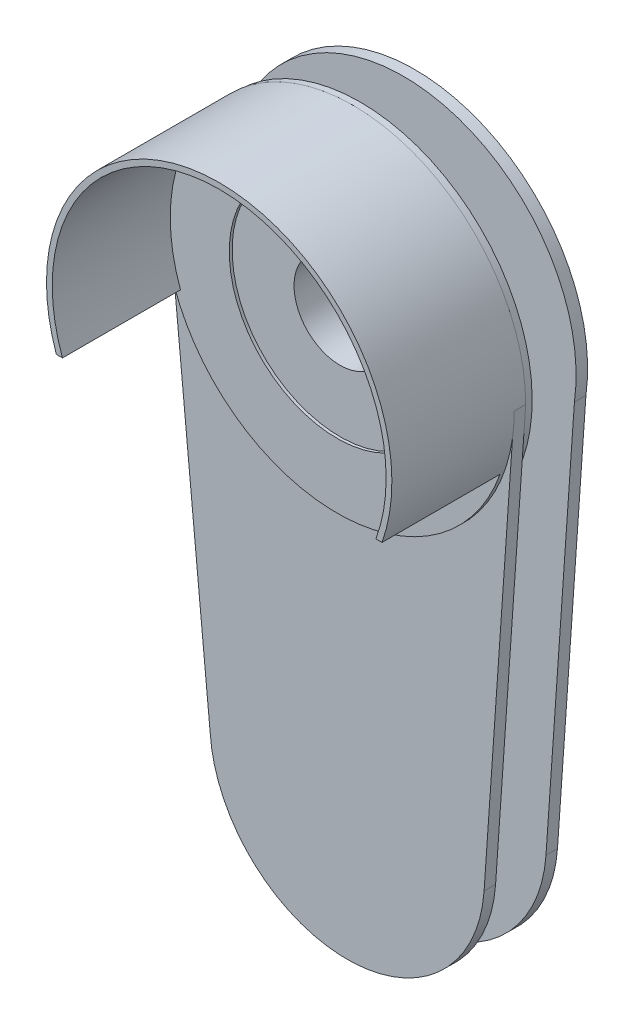
ISO-10303-21;
HEADER;
FILE_DESCRIPTION(('STEP AP214'),'2;1');
FILE_NAME('part.step','',(''),(''),'','','');
FILE_SCHEMA(('AUTOMOTIVE_DESIGN { 1 0 10303 214 1 1 1 1 }'));
ENDSEC;
DATA;
#1=APPLICATION_CONTEXT('core data for automotive mechanical design processes');
#2=APPLICATION_PROTOCOL_DEFINITION('international standard','automotive_design',2000,#1);
#3=PRODUCT_CONTEXT('',#1,'mechanical');
#4=PRODUCT('Part','Part','',(#3));
#5=PRODUCT_RELATED_PRODUCT_CATEGORY('part','',(#4));
#6=PRODUCT_DEFINITION_FORMATION('','',#4);
#7=PRODUCT_DEFINITION_CONTEXT('part definition',#1,'design');
#8=PRODUCT_DEFINITION('design','',#6,#7);
#9=PRODUCT_DEFINITION_SHAPE('','',#8);
#10=(LENGTH_UNIT() NAMED_UNIT(*) SI_UNIT(.MILLI.,.METRE.));
#11=(NAMED_UNIT(*) PLANE_ANGLE_UNIT() SI_UNIT($,.RADIAN.));
#12=(NAMED_UNIT(*) SI_UNIT($,.STERADIAN.) SOLID_ANGLE_UNIT());
#13=UNCERTAINTY_MEASURE_WITH_UNIT(LENGTH_MEASURE(1.E-05),#10,'distance_accuracy_value','');
#14=(GEOMETRIC_REPRESENTATION_CONTEXT(3) GLOBAL_UNCERTAINTY_ASSIGNED_CONTEXT((#13)) GLOBAL_UNIT_ASSIGNED_CONTEXT((#10,
#11,#12)) REPRESENTATION_CONTEXT('',''));
#15=CARTESIAN_POINT('',(0.,0.,0.));
#16=DIRECTION('',(0.,0.,1.));
#17=DIRECTION('',(1.,0.,0.));
#18=AXIS2_PLACEMENT_3D('',#15,#16,#17);
#19=CARTESIAN_POINT('',(0.,0.,0.));
#20=DIRECTION('',(0.,0.,1.));
#21=DIRECTION('',(1.,0.,0.));
#22=AXIS2_PLACEMENT_3D('',#19,#20,#21);
#23=PLANE('',#22);
#24=DIRECTION('',(-0.0697887398607694,-0.997561793468778,0.));
#25=VECTOR('',#24,1.);
#26=CARTESIAN_POINT('',(119.415543814638,-8.35422965993222,0.));
#27=LINE('',#26,#25);
#28=CARTESIAN_POINT('',(120.,0.,0.));
#29=VERTEX_POINT('',#28);
#30=CARTESIAN_POINT('',(118.831087629275,-16.7084593198645,0.));
#31=VERTEX_POINT('',#30);
#32=EDGE_CURVE('E202',#29,#31,#27,.T.);
#33=ORIENTED_EDGE('',*,*,#32,.F.);
#34=CARTESIAN_POINT('',(0.,0.,0.));
#35=DIRECTION('',(0.,0.,1.));
#36=DIRECTION('',(1.,0.,0.));
#37=AXIS2_PLACEMENT_3D('',#34,#35,#36);
#38=CIRCLE('',#37,120.);
#39=EDGE_CURVE('E247',#31,#29,#38,.T.);
#40=ORIENTED_EDGE('',*,*,#39,.F.);
#41=EDGE_LOOP('',(#33,#40));
#42=FACE_BOUND('',#41,.T.);
#43=ADVANCED_FACE('F34',(#42),#23,.F.);
#44=CARTESIAN_POINT('',(0.,0.,85.));
#45=DIRECTION('',(0.,0.,-1.));
#46=DIRECTION('',(-1.,0.,0.));
#47=AXIS2_PLACEMENT_3D('',#44,#45,#46);
#48=CYLINDRICAL_SURFACE('',#47,120.);
#49=ORIENTED_EDGE('',*,*,#39,.T.);
#50=DIRECTION('',(0.,0.,1.));
#51=VECTOR('',#50,1.);
#52=CARTESIAN_POINT('',(120.,0.,-8.));
#53=LINE('',#52,#51);
#54=CARTESIAN_POINT('',(120.,0.,-8.));
#55=VERTEX_POINT('',#54);
#56=EDGE_CURVE('E213',#55,#29,#53,.T.);
#57=ORIENTED_EDGE('',*,*,#56,.F.);
#58=CARTESIAN_POINT('',(0.,0.,-8.));
#59=DIRECTION('',(0.,0.,-1.));
#60=DIRECTION('',(-1.,0.,0.));
#61=AXIS2_PLACEMENT_3D('',#58,#59,#60);
#62=CIRCLE('',#61,120.);
#63=CARTESIAN_POINT('',(-120.,1.07552855510562E-13,-8.));
#64=VERTEX_POINT('',#63);
#65=EDGE_CURVE('E189',#64,#55,#62,.T.);
#66=ORIENTED_EDGE('',*,*,#65,.F.);
#67=DIRECTION('',(0.,0.,1.));
#68=VECTOR('',#67,1.);
#69=CARTESIAN_POINT('',(-120.,1.07552855510562E-13,-8.));
#70=LINE('',#69,#68);
#71=CARTESIAN_POINT('',(-120.,1.07552855510562E-13,0.));
#72=VERTEX_POINT('',#71);
#73=EDGE_CURVE('E216',#64,#72,#70,.T.);
#74=ORIENTED_EDGE('',*,*,#73,.T.);
#75=CARTESIAN_POINT('',(-117.805011812381,-22.8468639398211,0.));
#76=VERTEX_POINT('',#75);
#77=EDGE_CURVE('E257',#72,#76,#38,.T.);
#78=ORIENTED_EDGE('',*,*,#77,.T.);
#79=EDGE_CURVE('E259',#76,#31,#38,.T.);
#80=ORIENTED_EDGE('',*,*,#79,.T.);
#81=EDGE_LOOP('',(#49,#57,#66,#74,#78,#80));
#82=FACE_BOUND('',#81,.T.);
#83=DIRECTION('',(0.,0.,1.));
#84=VECTOR('',#83,1.);
#85=CARTESIAN_POINT('',(113.137084989848,-40.,3.));
#86=LINE('',#85,#84);
#87=CARTESIAN_POINT('',(113.137084989848,-40.,3.));
#88=VERTEX_POINT('',#87);
#89=CARTESIAN_POINT('',(113.137084989848,-40.,85.));
#90=VERTEX_POINT('',#89);
#91=EDGE_CURVE('E245',#88,#90,#86,.T.);
#92=ORIENTED_EDGE('',*,*,#91,.F.);
#93=CARTESIAN_POINT('',(0.,0.,3.));
#94=DIRECTION('',(0.,0.,1.));
#95=DIRECTION('',(1.,0.,0.));
#96=AXIS2_PLACEMENT_3D('',#93,#94,#95);
#97=CIRCLE('',#96,120.);
#98=CARTESIAN_POINT('',(-113.137084989848,-40.,3.));
#99=VERTEX_POINT('',#98);
#100=EDGE_CURVE('E233',#99,#88,#97,.T.);
#101=ORIENTED_EDGE('',*,*,#100,.F.);
#102=DIRECTION('',(0.,0.,1.));
#103=VECTOR('',#102,1.);
#104=CARTESIAN_POINT('',(-113.137084989848,-40.,3.));
#105=LINE('',#104,#103);
#106=CARTESIAN_POINT('',(-113.137084989848,-40.,85.));
#107=VERTEX_POINT('',#106);
#108=EDGE_CURVE('E248',#99,#107,#105,.T.);
#109=ORIENTED_EDGE('',*,*,#108,.T.);
#110=CARTESIAN_POINT('',(0.,0.,85.));
#111=DIRECTION('',(0.,0.,1.));
#112=DIRECTION('',(1.,0.,0.));
#113=AXIS2_PLACEMENT_3D('',#110,#111,#112);
#114=CIRCLE('',#113,120.);
#115=EDGE_CURVE('E255',#90,#107,#114,.T.);
#116=ORIENTED_EDGE('',*,*,#115,.F.);
#117=EDGE_LOOP('',(#92,#101,#109,#116));
#118=FACE_BOUND('',#117,.T.);
#119=ADVANCED_FACE('F36',(#82,#118),#48,.T.);
#120=CARTESIAN_POINT('',(0.,0.,85.));
#121=DIRECTION('',(0.,0.,1.));
#122=DIRECTION('',(1.,0.,0.));
#123=AXIS2_PLACEMENT_3D('',#120,#121,#122);
#124=PLANE('',#123);
#125=CARTESIAN_POINT('',(0.,0.,85.));
#126=DIRECTION('',(0.,0.,1.));
#127=DIRECTION('',(1.,0.,0.));
#128=AXIS2_PLACEMENT_3D('',#125,#126,#127);
#129=CIRCLE('',#128,116.);
#130=CARTESIAN_POINT('',(108.88526071053,-40.,85.));
#131=VERTEX_POINT('',#130);
#132=CARTESIAN_POINT('',(-108.88526071053,-40.,85.));
#133=VERTEX_POINT('',#132);
#134=EDGE_CURVE('E240',#131,#133,#129,.T.);
#135=ORIENTED_EDGE('',*,*,#134,.F.);
#136=DIRECTION('',(1.,0.,0.));
#137=VECTOR('',#136,1.);
#138=CARTESIAN_POINT('',(0.,-40.,85.));
#139=LINE('',#138,#137);
#140=EDGE_CURVE('E237',#131,#90,#139,.T.);
#141=ORIENTED_EDGE('',*,*,#140,.T.);
#142=ORIENTED_EDGE('',*,*,#115,.T.);
#143=DIRECTION('',(1.,0.,0.));
#144=VECTOR('',#143,1.);
#145=CARTESIAN_POINT('',(0.,-40.,85.));
#146=LINE('',#145,#144);
#147=EDGE_CURVE('E228',#107,#133,#146,.T.);
#148=ORIENTED_EDGE('',*,*,#147,.T.);
#149=EDGE_LOOP('',(#135,#141,#142,#148));
#150=FACE_BOUND('',#149,.T.);
#151=ADVANCED_FACE('F291',(#150),#124,.T.);
#152=ORIENTED_EDGE('',*,*,#77,.F.);
#153=DIRECTION('',(0.0956335930260791,-0.995416604183857,0.));
#154=VECTOR('',#153,1.);
#155=CARTESIAN_POINT('',(-118.902505906191,-11.4234319699105,0.));
#156=LINE('',#155,#154);
#157=EDGE_CURVE('E199',#72,#76,#156,.T.);
#158=ORIENTED_EDGE('',*,*,#157,.T.);
#159=EDGE_LOOP('',(#152,#158));
#160=FACE_BOUND('',#159,.T.);
#161=ADVANCED_FACE('F287',(#160),#23,.F.);
#162=CARTESIAN_POINT('',(0.,-40.,3.));
#163=DIRECTION('',(0.,-1.,0.));
#164=DIRECTION('',(0.,0.,-1.));
#165=AXIS2_PLACEMENT_3D('',#162,#163,#164);
#166=PLANE('',#165);
#167=ORIENTED_EDGE('',*,*,#140,.F.);
#168=DIRECTION('',(0.,0.,1.));
#169=VECTOR('',#168,1.);
#170=CARTESIAN_POINT('',(108.88526071053,-40.,3.));
#171=LINE('',#170,#169);
#172=CARTESIAN_POINT('',(108.88526071053,-40.,3.));
#173=VERTEX_POINT('',#172);
#174=EDGE_CURVE('E236',#173,#131,#171,.T.);
#175=ORIENTED_EDGE('',*,*,#174,.F.);
#176=DIRECTION('',(1.,0.,0.));
#177=VECTOR('',#176,1.);
#178=CARTESIAN_POINT('',(0.,-40.,3.));
#179=LINE('',#178,#177);
#180=EDGE_CURVE('E225',#173,#88,#179,.T.);
#181=ORIENTED_EDGE('',*,*,#180,.T.);
#182=ORIENTED_EDGE('',*,*,#91,.T.);
#183=EDGE_LOOP('',(#167,#175,#181,#182));
#184=FACE_BOUND('',#183,.T.);
#185=ADVANCED_FACE('F294',(#184),#166,.T.);
#186=CARTESIAN_POINT('',(0.,-40.,3.));
#187=DIRECTION('',(0.,-1.,0.));
#188=DIRECTION('',(0.,0.,-1.));
#189=AXIS2_PLACEMENT_3D('',#186,#187,#188);
#190=PLANE('',#189);
#191=ORIENTED_EDGE('',*,*,#147,.F.);
#192=ORIENTED_EDGE('',*,*,#108,.F.);
#193=DIRECTION('',(1.,0.,0.));
#194=VECTOR('',#193,1.);
#195=CARTESIAN_POINT('',(0.,-40.,3.));
#196=LINE('',#195,#194);
#197=CARTESIAN_POINT('',(-108.88526071053,-40.,3.));
#198=VERTEX_POINT('',#197);
#199=EDGE_CURVE('E231',#99,#198,#196,.T.);
#200=ORIENTED_EDGE('',*,*,#199,.T.);
#201=DIRECTION('',(0.,0.,1.));
#202=VECTOR('',#201,1.);
#203=CARTESIAN_POINT('',(-108.88526071053,-40.,3.));
#204=LINE('',#203,#202);
#205=EDGE_CURVE('E251',#198,#133,#204,.T.);
#206=ORIENTED_EDGE('',*,*,#205,.T.);
#207=EDGE_LOOP('',(#191,#192,#200,#206));
#208=FACE_BOUND('',#207,.T.);
#209=ADVANCED_FACE('F299',(#208),#190,.T.);
#210=CARTESIAN_POINT('',(0.,0.,3.));
#211=DIRECTION('',(0.,0.,1.));
#212=DIRECTION('',(1.,0.,0.));
#213=AXIS2_PLACEMENT_3D('',#210,#211,#212);
#214=CYLINDRICAL_SURFACE('',#213,116.);
#215=ORIENTED_EDGE('',*,*,#134,.T.);
#216=ORIENTED_EDGE('',*,*,#205,.F.);
#217=CARTESIAN_POINT('',(0.,0.,3.));
#218=DIRECTION('',(0.,0.,1.));
#219=DIRECTION('',(1.,0.,0.));
#220=AXIS2_PLACEMENT_3D('',#217,#218,#219);
#221=CIRCLE('',#220,116.);
#222=EDGE_CURVE('E227',#173,#198,#221,.T.);
#223=ORIENTED_EDGE('',*,*,#222,.F.);
#224=ORIENTED_EDGE('',*,*,#174,.T.);
#225=EDGE_LOOP('',(#215,#216,#223,#224));
#226=FACE_BOUND('',#225,.T.);
#227=ADVANCED_FACE('F307',(#226),#214,.F.);
#228=CARTESIAN_POINT('',(0.,0.,3.));
#229=DIRECTION('',(0.,0.,1.));
#230=DIRECTION('',(1.,0.,0.));
#231=AXIS2_PLACEMENT_3D('',#228,#229,#230);
#232=PLANE('',#231);
#233=CARTESIAN_POINT('',(0.,0.,3.));
#234=DIRECTION('',(0.,0.,1.));
#235=DIRECTION('',(1.,0.,0.));
#236=AXIS2_PLACEMENT_3D('',#233,#234,#235);
#237=CIRCLE('',#236,75.);
#238=CARTESIAN_POINT('',(75.,0.,3.));
#239=VERTEX_POINT('',#238);
#240=EDGE_CURVE('E38',#239,#239,#237,.T.);
#241=ORIENTED_EDGE('',*,*,#240,.F.);
#242=EDGE_LOOP('',(#241));
#243=FACE_BOUND('',#242,.T.);
#244=ORIENTED_EDGE('',*,*,#180,.F.);
#245=ORIENTED_EDGE('',*,*,#222,.T.);
#246=ORIENTED_EDGE('',*,*,#199,.F.);
#247=ORIENTED_EDGE('',*,*,#100,.T.);
#248=EDGE_LOOP('',(#244,#245,#246,#247));
#249=FACE_BOUND('',#248,.T.);
#250=ADVANCED_FACE('F310',(#243,#249),#232,.T.);
#251=CARTESIAN_POINT('',(0.,0.,1.));
#252=DIRECTION('',(0.,0.,1.));
#253=DIRECTION('',(1.,0.,0.));
#254=AXIS2_PLACEMENT_3D('',#251,#252,#253);
#255=CYLINDRICAL_SURFACE('',#254,75.);
#256=ORIENTED_EDGE('',*,*,#240,.T.);
#257=EDGE_LOOP('',(#256));
#258=FACE_BOUND('',#257,.T.);
#259=CARTESIAN_POINT('',(0.,0.,1.));
#260=DIRECTION('',(0.,0.,1.));
#261=DIRECTION('',(1.,0.,0.));
#262=AXIS2_PLACEMENT_3D('',#259,#260,#261);
#263=CIRCLE('',#262,75.);
#264=CARTESIAN_POINT('',(75.,0.,1.));
#265=VERTEX_POINT('',#264);
#266=EDGE_CURVE('E222',#265,#265,#263,.T.);
#267=ORIENTED_EDGE('',*,*,#266,.F.);
#268=EDGE_LOOP('',(#267));
#269=FACE_BOUND('',#268,.T.);
#270=ADVANCED_FACE('F317',(#258,#269),#255,.F.);
#271=CARTESIAN_POINT('',(0.,0.,1.));
#272=DIRECTION('',(0.,0.,1.));
#273=DIRECTION('',(1.,0.,0.));
#274=AXIS2_PLACEMENT_3D('',#271,#272,#273);
#275=PLANE('',#274);
#276=CARTESIAN_POINT('',(0.,0.,1.));
#277=DIRECTION('',(0.,0.,1.));
#278=DIRECTION('',(1.,0.,0.));
#279=AXIS2_PLACEMENT_3D('',#276,#277,#278);
#280=CIRCLE('',#279,32.);
#281=CARTESIAN_POINT('',(32.,0.,1.));
#282=VERTEX_POINT('',#281);
#283=EDGE_CURVE('E219',#282,#282,#280,.T.);
#284=ORIENTED_EDGE('',*,*,#283,.F.);
#285=EDGE_LOOP('',(#284));
#286=FACE_BOUND('',#285,.T.);
#287=ORIENTED_EDGE('',*,*,#266,.T.);
#288=EDGE_LOOP('',(#287));
#289=FACE_BOUND('',#288,.T.);
#290=ADVANCED_FACE('F321',(#286,#289),#275,.T.);
#291=CARTESIAN_POINT('',(0.,0.,-4.));
#292=DIRECTION('',(0.,0.,1.));
#293=DIRECTION('',(1.,0.,0.));
#294=AXIS2_PLACEMENT_3D('',#291,#292,#293);
#295=CYLINDRICAL_SURFACE('',#294,32.);
#296=ORIENTED_EDGE('',*,*,#283,.T.);
#297=EDGE_LOOP('',(#296));
#298=FACE_BOUND('',#297,.T.);
#299=CARTESIAN_POINT('',(0.,0.,-51.));
#300=DIRECTION('',(0.,0.,-1.));
#301=DIRECTION('',(-1.,0.,0.));
#302=AXIS2_PLACEMENT_3D('',#299,#300,#301);
#303=CIRCLE('',#302,32.);
#304=CARTESIAN_POINT('',(-32.,0.,-51.));
#305=VERTEX_POINT('',#304);
#306=EDGE_CURVE('E167',#305,#305,#303,.T.);
#307=ORIENTED_EDGE('',*,*,#306,.T.);
#308=EDGE_LOOP('',(#307));
#309=FACE_BOUND('',#308,.T.);
#310=ADVANCED_FACE('F325',(#298,#309),#295,.F.);
#311=CARTESIAN_POINT('',(-118.902505906191,-11.4234319699105,-8.));
#312=DIRECTION('',(-0.995416604183857,-0.0956335930260791,0.));
#313=DIRECTION('',(0.0956335930260791,-0.995416604183857,0.));
#314=AXIS2_PLACEMENT_3D('',#311,#312,#313);
#315=PLANE('',#314);
#316=ORIENTED_EDGE('',*,*,#157,.F.);
#317=ORIENTED_EDGE('',*,*,#73,.F.);
#318=DIRECTION('',(0.0956335930260791,-0.995416604183857,0.));
#319=VECTOR('',#318,1.);
#320=CARTESIAN_POINT('',(-118.902505906191,-11.4234319699105,-8.));
#321=LINE('',#320,#319);
#322=CARTESIAN_POINT('',(-119.112820752503,-9.23433833135846,-8.));
#323=VERTEX_POINT('',#322);
#324=EDGE_CURVE('E186',#64,#323,#321,.T.);
#325=ORIENTED_EDGE('',*,*,#324,.T.);
#326=CARTESIAN_POINT('',(-118.692191059879,-13.6125256084625,-8.));
#327=VERTEX_POINT('',#326);
#328=EDGE_CURVE('E190',#323,#327,#321,.T.);
#329=ORIENTED_EDGE('',*,*,#328,.T.);
#330=CARTESIAN_POINT('',(-91.3099220921763,-298.624981255157,-8.));
#331=VERTEX_POINT('',#330);
#332=EDGE_CURVE('E191',#327,#331,#321,.T.);
#333=ORIENTED_EDGE('',*,*,#332,.T.);
#334=DIRECTION('',(0.,0.,1.));
#335=VECTOR('',#334,1.);
#336=CARTESIAN_POINT('',(-91.3099220921763,-298.624981255157,-8.));
#337=LINE('',#336,#335);
#338=CARTESIAN_POINT('',(-91.3099220921763,-298.624981255157,0.));
#339=VERTEX_POINT('',#338);
#340=EDGE_CURVE('E198',#331,#339,#337,.T.);
#341=ORIENTED_EDGE('',*,*,#340,.T.);
#342=EDGE_CURVE('E183',#76,#339,#156,.T.);
#343=ORIENTED_EDGE('',*,*,#342,.F.);
#344=EDGE_LOOP('',(#316,#317,#325,#329,#333,#341,#343));
#345=FACE_BOUND('',#344,.T.);
#346=ADVANCED_FACE('F275',(#345),#315,.T.);
#347=CARTESIAN_POINT('',(119.415543814638,-8.35422965993222,-8.));
#348=DIRECTION('',(-0.997561793468778,0.0697887398607694,0.));
#349=DIRECTION('',(-0.0697887398607694,-0.997561793468779,0.));
#350=AXIS2_PLACEMENT_3D('',#347,#348,#349);
#351=PLANE('',#350);
#352=ORIENTED_EDGE('',*,*,#32,.T.);
#353=CARTESIAN_POINT('',(99.0633780417692,-299.268538040634,0.));
#354=VERTEX_POINT('',#353);
#355=EDGE_CURVE('E201',#31,#354,#27,.T.);
#356=ORIENTED_EDGE('',*,*,#355,.T.);
#357=DIRECTION('',(0.,0.,1.));
#358=VECTOR('',#357,1.);
#359=CARTESIAN_POINT('',(99.0633780417692,-299.268538040634,-8.));
#360=LINE('',#359,#358);
#361=CARTESIAN_POINT('',(99.0633780417692,-299.268538040634,-8.));
#362=VERTEX_POINT('',#361);
#363=EDGE_CURVE('E210',#362,#354,#360,.T.);
#364=ORIENTED_EDGE('',*,*,#363,.F.);
#365=DIRECTION('',(-0.0697887398607694,-0.997561793468778,0.));
#366=VECTOR('',#365,1.);
#367=CARTESIAN_POINT('',(119.415543814638,-8.35422965993222,-8.));
#368=LINE('',#367,#366);
#369=EDGE_CURVE('E193',#55,#362,#368,.T.);
#370=ORIENTED_EDGE('',*,*,#369,.F.);
#371=ORIENTED_EDGE('',*,*,#56,.T.);
#372=EDGE_LOOP('',(#352,#356,#364,#370,#371));
#373=FACE_BOUND('',#372,.T.);
#374=ADVANCED_FACE('F284',(#373),#351,.F.);
#375=CARTESIAN_POINT('',(3.8981465337455,-292.610843621114,-8.));
#376=DIRECTION('',(0.,0.,1.));
#377=DIRECTION('',(1.,0.,0.));
#378=AXIS2_PLACEMENT_3D('',#375,#376,#377);
#379=CYLINDRICAL_SURFACE('',#378,95.397831122932);
#380=CARTESIAN_POINT('',(3.8981465337455,-292.610843621114,0.));
#381=DIRECTION('',(0.,0.,-1.));
#382=DIRECTION('',(-1.,0.,0.));
#383=AXIS2_PLACEMENT_3D('',#380,#381,#382);
#384=CIRCLE('',#383,95.397831122932);
#385=EDGE_CURVE('E205',#354,#339,#384,.T.);
#386=ORIENTED_EDGE('',*,*,#385,.T.);
#387=ORIENTED_EDGE('',*,*,#340,.F.);
#388=CARTESIAN_POINT('',(3.8981465337455,-292.610843621114,-8.));
#389=DIRECTION('',(0.,0.,-1.));
#390=DIRECTION('',(-1.,0.,0.));
#391=AXIS2_PLACEMENT_3D('',#388,#389,#390);
#392=CIRCLE('',#391,95.397831122932);
#393=EDGE_CURVE('E195',#362,#331,#392,.T.);
#394=ORIENTED_EDGE('',*,*,#393,.F.);
#395=ORIENTED_EDGE('',*,*,#363,.T.);
#396=EDGE_LOOP('',(#386,#387,#394,#395));
#397=FACE_BOUND('',#396,.T.);
#398=ADVANCED_FACE('F280',(#397),#379,.T.);
#399=CARTESIAN_POINT('',(0.,0.,-8.));
#400=DIRECTION('',(0.,0.,-1.));
#401=DIRECTION('',(-1.,0.,0.));
#402=AXIS2_PLACEMENT_3D('',#399,#400,#401);
#403=PLANE('',#402);
#404=CARTESIAN_POINT('',(0.,0.,-8.));
#405=DIRECTION('',(0.,0.,-1.));
#406=DIRECTION('',(-1.,0.,0.));
#407=AXIS2_PLACEMENT_3D('',#404,#405,#406);
#408=CIRCLE('',#407,119.470235088225);
#409=EDGE_CURVE('E43',#323,#327,#408,.T.);
#410=ORIENTED_EDGE('',*,*,#409,.F.);
#411=ORIENTED_EDGE('',*,*,#324,.F.);
#412=ORIENTED_EDGE('',*,*,#65,.T.);
#413=ORIENTED_EDGE('',*,*,#369,.T.);
#414=ORIENTED_EDGE('',*,*,#393,.T.);
#415=ORIENTED_EDGE('',*,*,#332,.F.);
#416=EDGE_LOOP('',(#410,#411,#412,#413,#414,#415));
#417=FACE_BOUND('',#416,.T.);
#418=ADVANCED_FACE('F336',(#417),#403,.T.);
#419=CARTESIAN_POINT('',(0.,0.,0.));
#420=DIRECTION('',(0.,0.,-1.));
#421=DIRECTION('',(-1.,0.,0.));
#422=AXIS2_PLACEMENT_3D('',#419,#420,#421);
#423=PLANE('',#422);
#424=ORIENTED_EDGE('',*,*,#79,.F.);
#425=ORIENTED_EDGE('',*,*,#342,.T.);
#426=ORIENTED_EDGE('',*,*,#385,.F.);
#427=ORIENTED_EDGE('',*,*,#355,.F.);
#428=EDGE_LOOP('',(#424,#425,#426,#427));
#429=FACE_BOUND('',#428,.T.);
#430=ADVANCED_FACE('F272',(#429),#423,.F.);
#431=CARTESIAN_POINT('',(0.,0.,-8.));
#432=DIRECTION('',(0.,0.,-1.));
#433=DIRECTION('',(-1.,0.,0.));
#434=AXIS2_PLACEMENT_3D('',#431,#432,#433);
#435=PLANE('',#434);
#436=ORIENTED_EDGE('',*,*,#328,.F.);
#437=EDGE_CURVE('E178',#327,#323,#408,.T.);
#438=ORIENTED_EDGE('',*,*,#437,.F.);
#439=EDGE_LOOP('',(#436,#438));
#440=FACE_BOUND('',#439,.T.);
#441=ADVANCED_FACE('F339',(#440),#435,.F.);
#442=CARTESIAN_POINT('',(0.,0.,-13.));
#443=DIRECTION('',(0.,0.,-1.));
#444=DIRECTION('',(-1.,0.,0.));
#445=AXIS2_PLACEMENT_3D('',#442,#443,#444);
#446=PLANE('',#445);
#447=CARTESIAN_POINT('',(0.,0.,-13.));
#448=DIRECTION('',(0.,0.,-1.));
#449=DIRECTION('',(-1.,0.,0.));
#450=AXIS2_PLACEMENT_3D('',#447,#448,#449);
#451=CIRCLE('',#450,70.);
#452=CARTESIAN_POINT('',(-70.,0.,-13.));
#453=VERTEX_POINT('',#452);
#454=EDGE_CURVE('E11',#453,#453,#451,.T.);
#455=ORIENTED_EDGE('',*,*,#454,.F.);
#456=EDGE_LOOP('',(#455));
#457=FACE_BOUND('',#456,.T.);
#458=CARTESIAN_POINT('',(0.,0.,-13.));
#459=DIRECTION('',(0.,0.,-1.));
#460=DIRECTION('',(-1.,0.,0.));
#461=AXIS2_PLACEMENT_3D('',#458,#459,#460);
#462=CIRCLE('',#461,119.470235088225);
#463=CARTESIAN_POINT('',(-119.470235088225,0.,-13.));
#464=VERTEX_POINT('',#463);
#465=EDGE_CURVE('E180',#464,#464,#462,.T.);
#466=ORIENTED_EDGE('',*,*,#465,.T.);
#467=EDGE_LOOP('',(#466));
#468=FACE_BOUND('',#467,.T.);
#469=ADVANCED_FACE('F347',(#457,#468),#446,.T.);
#470=CARTESIAN_POINT('',(0.,0.,-13.));
#471=DIRECTION('',(0.,0.,1.));
#472=DIRECTION('',(1.,0.,0.));
#473=AXIS2_PLACEMENT_3D('',#470,#471,#472);
#474=CYLINDRICAL_SURFACE('',#473,119.470235088225);
#475=ORIENTED_EDGE('',*,*,#465,.F.);
#476=EDGE_LOOP('',(#475));
#477=FACE_BOUND('',#476,.T.);
#478=ORIENTED_EDGE('',*,*,#437,.T.);
#479=ORIENTED_EDGE('',*,*,#409,.T.);
#480=EDGE_LOOP('',(#478,#479));
#481=FACE_BOUND('',#480,.T.);
#482=ADVANCED_FACE('F343',(#477,#481),#474,.T.);
#483=CARTESIAN_POINT('',(0.,0.,-43.));
#484=DIRECTION('',(0.,0.,1.));
#485=DIRECTION('',(1.,0.,0.));
#486=AXIS2_PLACEMENT_3D('',#483,#484,#485);
#487=CYLINDRICAL_SURFACE('',#486,70.);
#488=CARTESIAN_POINT('',(0.,0.,-43.));
#489=DIRECTION('',(0.,0.,-1.));
#490=DIRECTION('',(-1.,0.,0.));
#491=AXIS2_PLACEMENT_3D('',#488,#489,#490);
#492=CIRCLE('',#491,70.);
#493=CARTESIAN_POINT('',(-70.,0.,-43.));
#494=VERTEX_POINT('',#493);
#495=EDGE_CURVE('E175',#494,#494,#492,.T.);
#496=ORIENTED_EDGE('',*,*,#495,.F.);
#497=EDGE_LOOP('',(#496));
#498=FACE_BOUND('',#497,.T.);
#499=ORIENTED_EDGE('',*,*,#454,.T.);
#500=EDGE_LOOP('',(#499));
#501=FACE_BOUND('',#500,.T.);
#502=ADVANCED_FACE('F346',(#498,#501),#487,.T.);
#503=CARTESIAN_POINT('',(0.,0.,-51.));
#504=DIRECTION('',(0.,0.,1.));
#505=DIRECTION('',(1.,0.,0.));
#506=AXIS2_PLACEMENT_3D('',#503,#504,#505);
#507=CYLINDRICAL_SURFACE('',#506,120.);
#508=CARTESIAN_POINT('',(0.,0.,-43.));
#509=DIRECTION('',(0.,0.,-1.));
#510=DIRECTION('',(-1.,0.,0.));
#511=AXIS2_PLACEMENT_3D('',#508,#509,#510);
#512=CIRCLE('',#511,120.);
#513=CARTESIAN_POINT('',(-117.805011812381,-22.8468639398209,-43.));
#514=VERTEX_POINT('',#513);
#515=CARTESIAN_POINT('',(118.831087629275,-16.7084593198645,-43.));
#516=VERTEX_POINT('',#515);
#517=EDGE_CURVE('E173',#514,#516,#512,.T.);
#518=ORIENTED_EDGE('',*,*,#517,.T.);
#519=DIRECTION('',(0.,0.,-1.));
#520=VECTOR('',#519,1.);
#521=CARTESIAN_POINT('',(118.831087629275,-16.7084593198645,-43.));
#522=LINE('',#521,#520);
#523=CARTESIAN_POINT('',(118.831087629275,-16.7084593198645,-51.));
#524=VERTEX_POINT('',#523);
#525=EDGE_CURVE('E56',#516,#524,#522,.T.);
#526=ORIENTED_EDGE('',*,*,#525,.T.);
#527=CARTESIAN_POINT('',(0.,0.,-51.));
#528=DIRECTION('',(0.,0.,-1.));
#529=DIRECTION('',(-1.,0.,0.));
#530=AXIS2_PLACEMENT_3D('',#527,#528,#529);
#531=CIRCLE('',#530,120.);
#532=CARTESIAN_POINT('',(-117.805011812381,-22.8468639398211,-51.));
#533=VERTEX_POINT('',#532);
#534=EDGE_CURVE('E51',#533,#524,#531,.T.);
#535=ORIENTED_EDGE('',*,*,#534,.F.);
#536=DIRECTION('',(0.,0.,-1.));
#537=VECTOR('',#536,1.);
#538=CARTESIAN_POINT('',(-117.805011812381,-22.8468639398209,-43.));
#539=LINE('',#538,#537);
#540=EDGE_CURVE('E168',#514,#533,#539,.T.);
#541=ORIENTED_EDGE('',*,*,#540,.F.);
#542=EDGE_LOOP('',(#518,#526,#535,#541));
#543=FACE_BOUND('',#542,.T.);
#544=ADVANCED_FACE('F357',(#543),#507,.T.);
#545=CARTESIAN_POINT('',(0.,0.,-51.));
#546=DIRECTION('',(0.,0.,-1.));
#547=DIRECTION('',(-1.,0.,0.));
#548=AXIS2_PLACEMENT_3D('',#545,#546,#547);
#549=PLANE('',#548);
#550=ORIENTED_EDGE('',*,*,#306,.F.);
#551=EDGE_LOOP('',(#550));
#552=FACE_BOUND('',#551,.T.);
#553=ORIENTED_EDGE('',*,*,#534,.T.);
#554=DIRECTION('',(-0.0697887398607694,-0.997561793468778,0.));
#555=VECTOR('',#554,1.);
#556=CARTESIAN_POINT('',(119.415543814638,-8.35422965993222,-51.));
#557=LINE('',#556,#555);
#558=CARTESIAN_POINT('',(99.0633780417692,-299.268538040633,-51.));
#559=VERTEX_POINT('',#558);
#560=EDGE_CURVE('E163',#524,#559,#557,.T.);
#561=ORIENTED_EDGE('',*,*,#560,.T.);
#562=CARTESIAN_POINT('',(3.8981465337455,-292.610843621114,-51.));
#563=DIRECTION('',(0.,0.,-1.));
#564=DIRECTION('',(-1.,0.,0.));
#565=AXIS2_PLACEMENT_3D('',#562,#563,#564);
#566=CIRCLE('',#565,95.397831122932);
#567=CARTESIAN_POINT('',(-91.3099220921763,-298.624981255157,-51.));
#568=VERTEX_POINT('',#567);
#569=EDGE_CURVE('E141',#559,#568,#566,.T.);
#570=ORIENTED_EDGE('',*,*,#569,.T.);
#571=DIRECTION('',(-0.0956335930260791,0.995416604183858,0.));
#572=VECTOR('',#571,1.);
#573=CARTESIAN_POINT('',(-118.902505906191,-11.4234319699105,-51.));
#574=LINE('',#573,#572);
#575=EDGE_CURVE('E157',#568,#533,#574,.T.);
#576=ORIENTED_EDGE('',*,*,#575,.T.);
#577=EDGE_LOOP('',(#553,#561,#570,#576));
#578=FACE_BOUND('',#577,.T.);
#579=ADVANCED_FACE('F361',(#552,#578),#549,.T.);
#580=CARTESIAN_POINT('',(0.,0.,-43.));
#581=DIRECTION('',(0.,0.,-1.));
#582=DIRECTION('',(-1.,0.,0.));
#583=AXIS2_PLACEMENT_3D('',#580,#581,#582);
#584=PLANE('',#583);
#585=ORIENTED_EDGE('',*,*,#495,.T.);
#586=EDGE_LOOP('',(#585));
#587=FACE_BOUND('',#586,.T.);
#588=ORIENTED_EDGE('',*,*,#517,.F.);
#589=DIRECTION('',(-0.0956335930260791,0.995416604183858,0.));
#590=VECTOR('',#589,1.);
#591=CARTESIAN_POINT('',(-118.902505906191,-11.4234319699105,-43.));
#592=LINE('',#591,#590);
#593=CARTESIAN_POINT('',(-91.3099220921763,-298.624981255157,-43.));
#594=VERTEX_POINT('',#593);
#595=EDGE_CURVE('E147',#594,#514,#592,.T.);
#596=ORIENTED_EDGE('',*,*,#595,.F.);
#597=CARTESIAN_POINT('',(3.8981465337455,-292.610843621114,-43.));
#598=DIRECTION('',(0.,0.,-1.));
#599=DIRECTION('',(-1.,0.,0.));
#600=AXIS2_PLACEMENT_3D('',#597,#598,#599);
#601=CIRCLE('',#600,95.397831122932);
#602=CARTESIAN_POINT('',(99.0633780417692,-299.268538040633,-43.));
#603=VERTEX_POINT('',#602);
#604=EDGE_CURVE('E139',#603,#594,#601,.T.);
#605=ORIENTED_EDGE('',*,*,#604,.F.);
#606=DIRECTION('',(-0.0697887398607694,-0.997561793468778,0.));
#607=VECTOR('',#606,1.);
#608=CARTESIAN_POINT('',(119.415543814638,-8.35422965993222,-43.));
#609=LINE('',#608,#607);
#610=EDGE_CURVE('E153',#516,#603,#609,.T.);
#611=ORIENTED_EDGE('',*,*,#610,.F.);
#612=EDGE_LOOP('',(#588,#596,#605,#611));
#613=FACE_BOUND('',#612,.T.);
#614=ADVANCED_FACE('F152',(#587,#613),#584,.F.);
#615=CARTESIAN_POINT('',(119.415543814638,-8.35422965993222,-43.));
#616=DIRECTION('',(0.997561793468778,-0.0697887398607694,0.));
#617=DIRECTION('',(0.0697887398607695,0.997561793468779,0.));
#618=AXIS2_PLACEMENT_3D('',#615,#616,#617);
#619=PLANE('',#618);
#620=ORIENTED_EDGE('',*,*,#560,.F.);
#621=ORIENTED_EDGE('',*,*,#525,.F.);
#622=ORIENTED_EDGE('',*,*,#610,.T.);
#623=DIRECTION('',(0.,0.,-1.));
#624=VECTOR('',#623,1.);
#625=CARTESIAN_POINT('',(99.0633780417692,-299.268538040633,-43.));
#626=LINE('',#625,#624);
#627=EDGE_CURVE('E136',#603,#559,#626,.T.);
#628=ORIENTED_EDGE('',*,*,#627,.T.);
#629=EDGE_LOOP('',(#620,#621,#622,#628));
#630=FACE_BOUND('',#629,.T.);
#631=ADVANCED_FACE('F156',(#630),#619,.T.);
#632=CARTESIAN_POINT('',(-118.902505906191,-11.4234319699105,-43.));
#633=DIRECTION('',(-0.995416604183857,-0.0956335930260791,0.));
#634=DIRECTION('',(0.0956335930260791,-0.995416604183857,0.));
#635=AXIS2_PLACEMENT_3D('',#632,#633,#634);
#636=PLANE('',#635);
#637=ORIENTED_EDGE('',*,*,#575,.F.);
#638=DIRECTION('',(0.,0.,-1.));
#639=VECTOR('',#638,1.);
#640=CARTESIAN_POINT('',(-91.3099220921763,-298.624981255157,-43.));
#641=LINE('',#640,#639);
#642=EDGE_CURVE('E146',#594,#568,#641,.T.);
#643=ORIENTED_EDGE('',*,*,#642,.F.);
#644=ORIENTED_EDGE('',*,*,#595,.T.);
#645=ORIENTED_EDGE('',*,*,#540,.T.);
#646=EDGE_LOOP('',(#637,#643,#644,#645));
#647=FACE_BOUND('',#646,.T.);
#648=ADVANCED_FACE('F370',(#647),#636,.T.);
#649=CARTESIAN_POINT('',(3.8981465337455,-292.610843621114,-43.));
#650=DIRECTION('',(0.,0.,-1.));
#651=DIRECTION('',(-1.,0.,0.));
#652=AXIS2_PLACEMENT_3D('',#649,#650,#651);
#653=CYLINDRICAL_SURFACE('',#652,95.397831122932);
#654=ORIENTED_EDGE('',*,*,#569,.F.);
#655=ORIENTED_EDGE('',*,*,#627,.F.);
#656=ORIENTED_EDGE('',*,*,#604,.T.);
#657=ORIENTED_EDGE('',*,*,#642,.T.);
#658=EDGE_LOOP('',(#654,#655,#656,#657));
#659=FACE_BOUND('',#658,.T.);
#660=ADVANCED_FACE('F138',(#659),#653,.T.);
#661=CLOSED_SHELL('',(#43,#119,#151,#161,#185,#209,#227,#250,#270,#290,#310,#346,#374,#398,#418,
#430,#441,#469,#482,#502,#544,#579,#614,#631,#648,#660));
#662=MANIFOLD_SOLID_BREP('B2',#661);
#663=ADVANCED_BREP_SHAPE_REPRESENTATION('',(#18,#662),#14);
#664=SHAPE_DEFINITION_REPRESENTATION(#9,#663);
ENDSEC;
END-ISO-10303-21;
